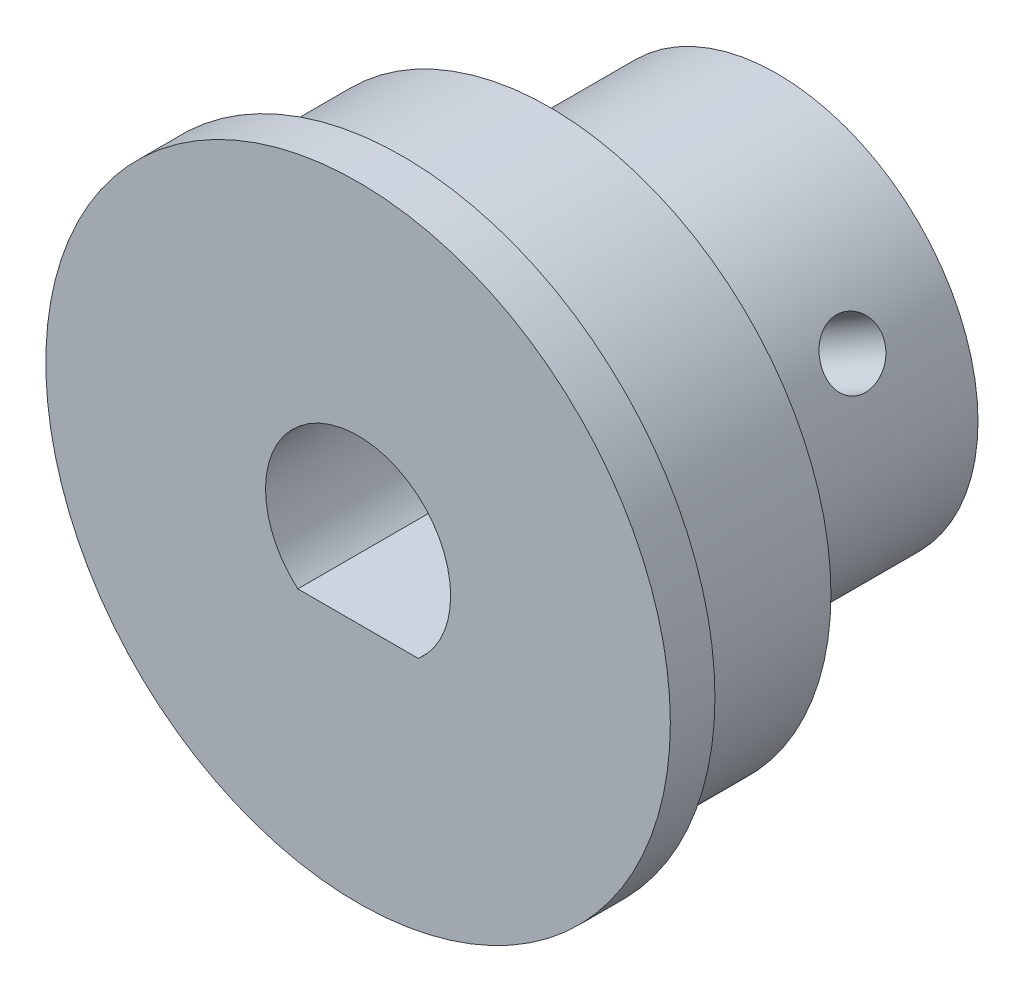
ISO-10303-21;
HEADER;
FILE_DESCRIPTION(('STEP AP214'),'2;1');
FILE_NAME('part.step','',(''),(''),'','','');
FILE_SCHEMA(('AUTOMOTIVE_DESIGN { 1 0 10303 214 1 1 1 1 }'));
ENDSEC;
DATA;
#1=APPLICATION_CONTEXT('core data for automotive mechanical design processes');
#2=APPLICATION_PROTOCOL_DEFINITION('international standard','automotive_design',2000,#1);
#3=PRODUCT_CONTEXT('',#1,'mechanical');
#4=PRODUCT('Part','Part','',(#3));
#5=PRODUCT_RELATED_PRODUCT_CATEGORY('part','',(#4));
#6=PRODUCT_DEFINITION_FORMATION('','',#4);
#7=PRODUCT_DEFINITION_CONTEXT('part definition',#1,'design');
#8=PRODUCT_DEFINITION('design','',#6,#7);
#9=PRODUCT_DEFINITION_SHAPE('','',#8);
#10=(LENGTH_UNIT() NAMED_UNIT(*) SI_UNIT(.MILLI.,.METRE.));
#11=(NAMED_UNIT(*) PLANE_ANGLE_UNIT() SI_UNIT($,.RADIAN.));
#12=(NAMED_UNIT(*) SI_UNIT($,.STERADIAN.) SOLID_ANGLE_UNIT());
#13=UNCERTAINTY_MEASURE_WITH_UNIT(LENGTH_MEASURE(1.E-05),#10,'distance_accuracy_value','');
#14=(GEOMETRIC_REPRESENTATION_CONTEXT(3) GLOBAL_UNCERTAINTY_ASSIGNED_CONTEXT((#13)) GLOBAL_UNIT_ASSIGNED_CONTEXT((#10,
#11,#12)) REPRESENTATION_CONTEXT('',''));
#15=CARTESIAN_POINT('',(0.,0.,0.));
#16=DIRECTION('',(0.,0.,1.));
#17=DIRECTION('',(1.,0.,0.));
#18=AXIS2_PLACEMENT_3D('',#15,#16,#17);
#19=CARTESIAN_POINT('',(0.,0.,8.6));
#20=DIRECTION('',(0.,0.,1.));
#21=DIRECTION('',(1.,0.,0.));
#22=AXIS2_PLACEMENT_3D('',#19,#20,#21);
#23=PLANE('',#22);
#24=CARTESIAN_POINT('',(0.,0.,8.6));
#25=DIRECTION('',(0.,0.,1.));
#26=DIRECTION('',(1.,0.,0.));
#27=AXIS2_PLACEMENT_3D('',#24,#25,#26);
#28=CIRCLE('',#27,14.);
#29=CARTESIAN_POINT('',(14.,0.,8.6));
#30=VERTEX_POINT('',#29);
#31=EDGE_CURVE('E116',#30,#30,#28,.T.);
#32=ORIENTED_EDGE('',*,*,#31,.T.);
#33=EDGE_LOOP('',(#32));
#34=FACE_BOUND('',#33,.T.);
#35=CARTESIAN_POINT('',(0.,0.,8.6));
#36=DIRECTION('',(0.,0.,1.));
#37=DIRECTION('',(1.,0.,0.));
#38=AXIS2_PLACEMENT_3D('',#35,#36,#37);
#39=CIRCLE('',#38,4.15);
#40=CARTESIAN_POINT('',(2.70185121722126,-3.15,8.6));
#41=VERTEX_POINT('',#40);
#42=CARTESIAN_POINT('',(-2.70185121722126,-3.15,8.6));
#43=VERTEX_POINT('',#42);
#44=EDGE_CURVE('E89',#41,#43,#39,.T.);
#45=ORIENTED_EDGE('',*,*,#44,.F.);
#46=DIRECTION('',(-1.,0.,0.));
#47=VECTOR('',#46,1.);
#48=CARTESIAN_POINT('',(0.,-3.15,8.6));
#49=LINE('',#48,#47);
#50=EDGE_CURVE('E61',#41,#43,#49,.T.);
#51=ORIENTED_EDGE('',*,*,#50,.T.);
#52=EDGE_LOOP('',(#45,#51));
#53=FACE_BOUND('',#52,.T.);
#54=ADVANCED_FACE('F33',(#34,#53),#23,.T.);
#55=CARTESIAN_POINT('',(0.193153064458329,0.,-10.));
#56=DIRECTION('',(0.,0.,-1.));
#57=DIRECTION('',(-1.,0.,0.));
#58=AXIS2_PLACEMENT_3D('',#55,#56,#57);
#59=PLANE('',#58);
#60=CARTESIAN_POINT('',(0.193153064458329,0.,-10.));
#61=DIRECTION('',(0.,0.,-1.));
#62=DIRECTION('',(-1.,0.,0.));
#63=AXIS2_PLACEMENT_3D('',#60,#61,#62);
#64=CIRCLE('',#63,9.);
#65=CARTESIAN_POINT('',(-8.80684693554167,0.,-10.));
#66=VERTEX_POINT('',#65);
#67=EDGE_CURVE('E109',#66,#66,#64,.T.);
#68=ORIENTED_EDGE('',*,*,#67,.T.);
#69=EDGE_LOOP('',(#68));
#70=FACE_BOUND('',#69,.T.);
#71=CARTESIAN_POINT('',(0.,0.,-10.));
#72=DIRECTION('',(0.,0.,1.));
#73=DIRECTION('',(1.,0.,0.));
#74=AXIS2_PLACEMENT_3D('',#71,#72,#73);
#75=CIRCLE('',#74,4.15);
#76=CARTESIAN_POINT('',(2.70185121722126,-3.15,-10.));
#77=VERTEX_POINT('',#76);
#78=CARTESIAN_POINT('',(-2.70185121722126,-3.15,-10.));
#79=VERTEX_POINT('',#78);
#80=EDGE_CURVE('E100',#77,#79,#75,.T.);
#81=ORIENTED_EDGE('',*,*,#80,.T.);
#82=DIRECTION('',(-1.,0.,0.));
#83=VECTOR('',#82,1.);
#84=CARTESIAN_POINT('',(0.,-3.15,-10.));
#85=LINE('',#84,#83);
#86=EDGE_CURVE('E95',#77,#79,#85,.T.);
#87=ORIENTED_EDGE('',*,*,#86,.F.);
#88=EDGE_LOOP('',(#81,#87));
#89=FACE_BOUND('',#88,.T.);
#90=ADVANCED_FACE('F142',(#70,#89),#59,.T.);
#91=CARTESIAN_POINT('',(0.,0.,6.6));
#92=DIRECTION('',(0.,0.,-1.));
#93=DIRECTION('',(-1.,0.,0.));
#94=AXIS2_PLACEMENT_3D('',#91,#92,#93);
#95=CYLINDRICAL_SURFACE('',#94,12.6);
#96=CARTESIAN_POINT('',(0.,0.,6.6));
#97=DIRECTION('',(0.,0.,1.));
#98=DIRECTION('',(1.,0.,0.));
#99=AXIS2_PLACEMENT_3D('',#96,#97,#98);
#100=CIRCLE('',#99,12.6);
#101=CARTESIAN_POINT('',(12.6,0.,6.6));
#102=VERTEX_POINT('',#101);
#103=EDGE_CURVE('E115',#102,#102,#100,.T.);
#104=ORIENTED_EDGE('',*,*,#103,.F.);
#105=EDGE_LOOP('',(#104));
#106=FACE_BOUND('',#105,.T.);
#107=CARTESIAN_POINT('',(0.,0.,0.));
#108=DIRECTION('',(0.,0.,1.));
#109=DIRECTION('',(1.,0.,0.));
#110=AXIS2_PLACEMENT_3D('',#107,#108,#109);
#111=CIRCLE('',#110,12.6);
#112=CARTESIAN_POINT('',(12.6,0.,0.));
#113=VERTEX_POINT('',#112);
#114=EDGE_CURVE('E119',#113,#113,#111,.T.);
#115=ORIENTED_EDGE('',*,*,#114,.T.);
#116=EDGE_LOOP('',(#115));
#117=FACE_BOUND('',#116,.T.);
#118=ADVANCED_FACE('F35',(#106,#117),#95,.T.);
#119=CARTESIAN_POINT('',(0.,0.,0.));
#120=DIRECTION('',(0.,0.,1.));
#121=DIRECTION('',(1.,0.,0.));
#122=AXIS2_PLACEMENT_3D('',#119,#120,#121);
#123=PLANE('',#122);
#124=CARTESIAN_POINT('',(0.193153064458329,0.,0.));
#125=DIRECTION('',(0.,0.,-1.));
#126=DIRECTION('',(-1.,0.,0.));
#127=AXIS2_PLACEMENT_3D('',#124,#125,#126);
#128=CIRCLE('',#127,9.);
#129=CARTESIAN_POINT('',(-8.80684693554167,0.,0.));
#130=VERTEX_POINT('',#129);
#131=EDGE_CURVE('E74',#130,#130,#128,.T.);
#132=ORIENTED_EDGE('',*,*,#131,.F.);
#133=EDGE_LOOP('',(#132));
#134=FACE_BOUND('',#133,.T.);
#135=ORIENTED_EDGE('',*,*,#114,.F.);
#136=EDGE_LOOP('',(#135));
#137=FACE_BOUND('',#136,.T.);
#138=ADVANCED_FACE('F149',(#134,#137),#123,.F.);
#139=CARTESIAN_POINT('',(0.,0.,8.6));
#140=DIRECTION('',(0.,0.,-1.));
#141=DIRECTION('',(-1.,0.,0.));
#142=AXIS2_PLACEMENT_3D('',#139,#140,#141);
#143=CYLINDRICAL_SURFACE('',#142,14.);
#144=ORIENTED_EDGE('',*,*,#31,.F.);
#145=EDGE_LOOP('',(#144));
#146=FACE_BOUND('',#145,.T.);
#147=CARTESIAN_POINT('',(0.,0.,6.6));
#148=DIRECTION('',(0.,0.,1.));
#149=DIRECTION('',(1.,0.,0.));
#150=AXIS2_PLACEMENT_3D('',#147,#148,#149);
#151=CIRCLE('',#150,14.);
#152=CARTESIAN_POINT('',(14.,0.,6.6));
#153=VERTEX_POINT('',#152);
#154=EDGE_CURVE('E112',#153,#153,#151,.T.);
#155=ORIENTED_EDGE('',*,*,#154,.T.);
#156=EDGE_LOOP('',(#155));
#157=FACE_BOUND('',#156,.T.);
#158=ADVANCED_FACE('F196',(#146,#157),#143,.T.);
#159=CARTESIAN_POINT('',(0.,0.,6.6));
#160=DIRECTION('',(0.,0.,1.));
#161=DIRECTION('',(1.,0.,0.));
#162=AXIS2_PLACEMENT_3D('',#159,#160,#161);
#163=PLANE('',#162);
#164=ORIENTED_EDGE('',*,*,#103,.T.);
#165=EDGE_LOOP('',(#164));
#166=FACE_BOUND('',#165,.T.);
#167=ORIENTED_EDGE('',*,*,#154,.F.);
#168=EDGE_LOOP('',(#167));
#169=FACE_BOUND('',#168,.T.);
#170=ADVANCED_FACE('F189',(#166,#169),#163,.F.);
#171=CARTESIAN_POINT('',(0.193153064458329,0.,-10.));
#172=DIRECTION('',(0.,0.,1.));
#173=DIRECTION('',(1.,0.,0.));
#174=AXIS2_PLACEMENT_3D('',#171,#172,#173);
#175=CYLINDRICAL_SURFACE('',#174,9.);
#176=CARTESIAN_POINT('',(-6.71407297693941,5.76976848868625,-5.5));
#177=CARTESIAN_POINT('',(-6.71407570241382,5.76976643820043,-5.42479937004048));
#178=CARTESIAN_POINT('',(-6.71818204103032,5.76486032693949,-5.34955499954005));
#179=CARTESIAN_POINT('',(-6.73442199556218,5.74533365397885,-5.20117490103493));
#180=CARTESIAN_POINT('',(-6.74656345932425,5.73070359491148,-5.12804130756126));
#181=CARTESIAN_POINT('',(-6.77828787676516,5.69206743452031,-4.98605685263484));
#182=CARTESIAN_POINT('',(-6.79786437959359,5.66806946056385,-4.91720233862304));
#183=CARTESIAN_POINT('',(-6.84357221791581,5.61122280462049,-4.78561264350414));
#184=CARTESIAN_POINT('',(-6.86970272547886,5.57837524051396,-4.72287669086263));
#185=CARTESIAN_POINT('',(-6.92767214164482,5.5041873454294,-4.60465456654698));
#186=CARTESIAN_POINT('',(-6.95956101503921,5.46277217546627,-4.5492398553692));
#187=CARTESIAN_POINT('',(-7.02758565840639,5.37253375195583,-4.44784634558882));
#188=CARTESIAN_POINT('',(-7.06372173656648,5.32370996074641,-4.40186823239386));
#189=CARTESIAN_POINT('',(-7.13914881096259,5.21934102345788,-4.32030402626701));
#190=CARTESIAN_POINT('',(-7.17846238289371,5.16374603965025,-4.28480250029127));
#191=CARTESIAN_POINT('',(-7.25854219089167,5.04749579534749,-4.22572220603851));
#192=CARTESIAN_POINT('',(-7.29930836071933,4.98684076542421,-4.20214289484558));
#193=CARTESIAN_POINT('',(-7.38060034365181,4.86248260701304,-4.16774830656838));
#194=CARTESIAN_POINT('',(-7.4211258932378,4.7988031688341,-4.15684681532878));
#195=CARTESIAN_POINT('',(-7.50092845965021,4.66978169689071,-4.14787133954996));
#196=CARTESIAN_POINT('',(-7.54020556196711,4.60443977752282,-4.14979647476641));
#197=CARTESIAN_POINT('',(-7.61600053114387,4.47467440648357,-4.16634762043307));
#198=CARTESIAN_POINT('',(-7.65254251121858,4.41024839640291,-4.18084352096416));
#199=CARTESIAN_POINT('',(-7.72242402234965,4.28355882825896,-4.22194135628796));
#200=CARTESIAN_POINT('',(-7.75576352614665,4.22129528860539,-4.24854339411658));
#201=CARTESIAN_POINT('',(-7.81860382140223,4.10077790205113,-4.31311239636955));
#202=CARTESIAN_POINT('',(-7.8481012364031,4.04252760290949,-4.35108926167315));
#203=CARTESIAN_POINT('',(-7.90276886952091,3.931902982938,-4.43732514656782));
#204=CARTESIAN_POINT('',(-7.9279388417112,3.87952899611505,-4.48558475017353));
#205=CARTESIAN_POINT('',(-7.97386934107694,3.78188944332668,-4.59151795651766));
#206=CARTESIAN_POINT('',(-7.99458902200598,3.73669064281558,-4.6492708310444));
#207=CARTESIAN_POINT('',(-8.03117470049944,3.65546487480578,-4.77227877462203));
#208=CARTESIAN_POINT('',(-8.04704062441281,3.61943804648426,-4.83753395749251));
#209=CARTESIAN_POINT('',(-8.07387692762173,3.55771782359596,-4.97390427536972));
#210=CARTESIAN_POINT('',(-8.08483475332455,3.53205094335543,-5.0450338920392));
#211=CARTESIAN_POINT('',(-8.10176485716089,3.4921070391261,-5.19098809641853));
#212=CARTESIAN_POINT('',(-8.10773738928179,3.47782943488581,-5.26581249568335));
#213=CARTESIAN_POINT('',(-8.11466519736122,3.46124793797269,-5.41648456781597));
#214=CARTESIAN_POINT('',(-8.11565451881994,3.45886279664091,-5.49232173792764));
#215=CARTESIAN_POINT('',(-8.11270699826652,3.46593460295485,-5.64334378552298));
#216=CARTESIAN_POINT('',(-8.10877026995471,3.47539127727442,-5.71852867802183));
#217=CARTESIAN_POINT('',(-8.0960007829333,3.50573742654533,-5.86581010292219));
#218=CARTESIAN_POINT('',(-8.0871873155837,3.52658184985431,-5.9379176058598));
#219=CARTESIAN_POINT('',(-8.06469588710246,3.57892964748476,-6.07734587310256));
#220=CARTESIAN_POINT('',(-8.05101772434426,3.6104334636024,-6.14466643886519));
#221=CARTESIAN_POINT('',(-8.01875438282484,3.68322741907835,-6.27303848141497));
#222=CARTESIAN_POINT('',(-8.00014119962749,3.72457326701454,-6.33405132706635));
#223=CARTESIAN_POINT('',(-7.95816267280673,3.81556757428929,-6.44767488355333));
#224=CARTESIAN_POINT('',(-7.93479714318406,3.86521635857799,-6.50028526538602));
#225=CARTESIAN_POINT('',(-7.88339938335785,3.97149811367249,-6.59590191038237));
#226=CARTESIAN_POINT('',(-7.8553422131521,4.02816796636464,-6.63885380571207));
#227=CARTESIAN_POINT('',(-7.79504492899107,4.1464555070708,-6.71354685115284));
#228=CARTESIAN_POINT('',(-7.76280497322823,4.20807300793181,-6.74528842506797));
#229=CARTESIAN_POINT('',(-7.69490671365392,4.33400517119871,-6.79650258580824));
#230=CARTESIAN_POINT('',(-7.65926598722268,4.3983050908718,-6.81603469950309));
#231=CARTESIAN_POINT('',(-7.58525021296572,4.52791433936262,-6.84249810008966));
#232=CARTESIAN_POINT('',(-7.54687532121797,4.59322361039581,-6.84943010565211));
#233=CARTESIAN_POINT('',(-7.46874854953235,4.72238440275397,-6.85049796377113));
#234=CARTESIAN_POINT('',(-7.42901054048841,4.78624348608914,-6.84473827401586));
#235=CARTESIAN_POINT('',(-7.34905007140405,4.91128100991115,-6.82083121983712));
#236=CARTESIAN_POINT('',(-7.30882760464473,4.97245941316517,-6.80268368341286));
#237=CARTESIAN_POINT('',(-7.22911975684115,5.0906741841653,-6.75449912379762));
#238=CARTESIAN_POINT('',(-7.1896362064918,5.1477010737265,-6.7244358452744));
#239=CARTESIAN_POINT('',(-7.11287368426254,5.2560811203969,-6.65329038498781));
#240=CARTESIAN_POINT('',(-7.07559481186651,5.30743402156375,-6.61220770644742));
#241=CARTESIAN_POINT('',(-7.00422599964837,5.40382976460162,-6.51965198407869));
#242=CARTESIAN_POINT('',(-6.97017566616031,5.44879694995553,-6.46806957622605));
#243=CARTESIAN_POINT('',(-6.90708785427668,5.53075590349029,-6.35620738326882));
#244=CARTESIAN_POINT('',(-6.8780515389651,5.56774582170677,-6.29592558613492));
#245=CARTESIAN_POINT('',(-6.82612074651695,5.63307638629953,-6.16804903107758));
#246=CARTESIAN_POINT('',(-6.80325384004222,5.66137828159677,-6.10042327968924));
#247=CARTESIAN_POINT('',(-6.76489458652679,5.70845892434937,-5.9600199943986));
#248=CARTESIAN_POINT('',(-6.74939436780951,5.72724783831319,-5.88724805544607));
#249=CARTESIAN_POINT('',(-6.73004240655255,5.75060959203054,-5.76178089391321));
#250=CARTESIAN_POINT('',(-6.72406777429479,5.75778560529872,-5.70987301062038));
#251=CARTESIAN_POINT('',(-6.71608213820538,5.76736573177228,-5.60531722875668));
#252=CARTESIAN_POINT('',(-6.71407106805985,5.76976992481439,-5.55266934258155));
#253=CARTESIAN_POINT('',(-6.71407297693941,5.76976848868625,-5.5));
#254=B_SPLINE_CURVE_WITH_KNOTS('',3,(#176,#177,#178,#179,#180,#181,#182,#183,#184,#185,#186,
#187,#188,#189,#190,#191,#192,#193,#194,#195,#196,#197,#198,#199,#200,#201,#202,#203,#204,#205,
#206,#207,#208,#209,#210,#211,#212,#213,#214,#215,#216,#217,#218,#219,#220,#221,#222,#223,#224,
#225,#226,#227,#228,#229,#230,#231,#232,#233,#234,#235,#236,#237,#238,#239,#240,#241,#242,#243,
#244,#245,#246,#247,#248,#249,#250,#251,#252,#253),.UNSPECIFIED.,.T.,.F.,(4,2,2,2,2,2,2,2,2,2,2,
2,2,2,2,2,2,2,2,2,2,2,2,2,2,2,2,2,2,2,2,2,2,2,2,2,2,2,4),(0.,0.225408914531807,
0.451038309820972,0.676472388224373,0.901878003132472,1.12934265922539,1.35682383089733,
1.58609392898298,1.81535358558581,2.04304489728038,2.27072058351643,2.49606753179796,
2.72141639805382,2.94696198535868,3.17252038608444,3.40006806824574,3.62761920305114,
3.85574907448142,4.08386732259548,4.31042492313896,4.53697729450321,4.76263981357883,
4.98831168675705,5.21529264104505,5.44228248071494,5.67051973277035,5.89874835543597,
6.12585539501303,6.35294948070856,6.57818147831605,6.80341660325206,7.02915079860248,
7.25489517222135,7.48312370985854,7.71140511794868,7.94069040866216,8.16973014256968,
8.32760565482416,8.48547852566053),.UNSPECIFIED.);
#255=CARTESIAN_POINT('',(-6.71407297693941,5.76976848868625,-5.5));
#256=VERTEX_POINT('',#255);
#257=EDGE_CURVE('E79',#256,#256,#254,.T.);
#258=ORIENTED_EDGE('',*,*,#257,.T.);
#259=EDGE_LOOP('',(#258));
#260=FACE_BOUND('',#259,.T.);
#261=CARTESIAN_POINT('',(8.64353217031446,3.09694897718871,-5.5));
#262=CARTESIAN_POINT('',(8.64353175727885,3.0969523627617,-5.42479937004048));
#263=CARTESIAN_POINT('',(8.64133610960133,3.10296161195058,-5.34955499954005));
#264=CARTESIAN_POINT('',(8.63254549203196,3.12678916161181,-5.20117490103493));
#265=CARTESIAN_POINT('',(8.62594622110178,3.14461900720257,-5.12804130756126));
#266=CARTESIAN_POINT('',(8.60834853341879,3.19141123882224,-4.98605685263484));
#267=CARTESIAN_POINT('',(8.59735392974736,3.22036397456716,-4.91720233862303));
#268=CARTESIAN_POINT('',(8.57097720074133,3.28837145167795,-4.78561264350414));
#269=CARTESIAN_POINT('',(8.55559562955415,3.32742491709459,-4.72287669086263));
#270=CARTESIAN_POINT('',(8.52033173584061,3.41472185167916,-4.60465456654698));
#271=CARTESIAN_POINT('',(8.50040958324768,3.46304601111832,-4.5492398553692));
#272=CARTESIAN_POINT('',(8.45627313777378,3.5670762921129,-4.44784634558882));
#273=CARTESIAN_POINT('',(8.4320585333574,3.62278294939739,-4.40186823239385));
#274=CARTESIAN_POINT('',(8.3793859194976,3.74028918060182,-4.32030402626701));
#275=CARTESIAN_POINT('',(8.35089603716277,3.8021332245115,-4.28480250029127));
#276=CARTESIAN_POINT('',(8.29026027639942,3.92960949471929,-4.22572220603851));
#277=CARTESIAN_POINT('',(8.25811456453238,3.99524154836667,-4.20214289484558));
#278=CARTESIAN_POINT('',(8.19106323164669,4.1278215499158,-4.16774830656838));
#279=CARTESIAN_POINT('',(8.15617799527801,4.19475742444906,-4.15684681532878));
#280=CARTESIAN_POINT('',(8.08434340614758,4.32837921022109,-4.14787133954996));
#281=CARTESIAN_POINT('',(8.0473941952014,4.39506513829853,-4.14979647476641));
#282=CARTESIAN_POINT('',(7.97291157193827,4.52558819260428,-4.16634762043307));
#283=CARTESIAN_POINT('',(7.93538800058131,4.58944748069389,-4.18084352096416));
#284=CARTESIAN_POINT('',(7.8606123717397,4.71331142866022,-4.22194135628796));
#285=CARTESIAN_POINT('',(7.82336031656868,4.77331605572477,-4.24854339411658));
#286=CARTESIAN_POINT('',(7.75040934584276,4.88799604107455,-4.31311239636955));
#287=CARTESIAN_POINT('',(7.7147118145085,4.9426667013821,-4.35108926167315));
#288=CARTESIAN_POINT('',(7.64624189988809,5.04532257041263,-4.43732514656782));
#289=CARTESIAN_POINT('',(7.61346968289709,5.09330739915345,-4.48558475017353));
#290=CARTESIAN_POINT('',(7.55187659945108,5.18190415480687,-4.59151795651766));
#291=CARTESIAN_POINT('',(7.5230931304524,5.22244732510527,-4.6492708310444));
#292=CARTESIAN_POINT('',(7.47104239116075,5.2947443361002,-4.77227877462203));
#293=CARTESIAN_POINT('',(7.44777520457321,5.32649804342445,-4.83753395749251));
#294=CARTESIAN_POINT('',(7.40774207522916,5.38059907519119,-4.97390427536972));
#295=CARTESIAN_POINT('',(7.39099281775639,5.40292227074034,-5.0450338920392));
#296=CARTESIAN_POINT('',(7.36486543388563,5.43755612286598,-5.19098809641853));
#297=CARTESIAN_POINT('',(7.3554869319688,5.44986728952774,-5.26581249568335));
#298=CARTESIAN_POINT('',(7.34459083844898,5.46415769577363,-5.41648456781597));
#299=CARTESIAN_POINT('',(7.3430199061934,5.46620704395528,-5.49232173792764));
#300=CARTESIAN_POINT('',(7.34767050983521,5.46011851312087,-5.64334378552298));
#301=CARTESIAN_POINT('',(7.35389186587537,5.45198086923527,-5.71852867802183));
#302=CARTESIAN_POINT('',(7.37378765854031,5.42574909444597,-5.86581010292219));
#303=CARTESIAN_POINT('',(7.38743272497832,5.4076941961713,-5.9379176058598));
#304=CARTESIAN_POINT('',(7.42152153331783,5.36204214892392,-6.07734587310256));
#305=CARTESIAN_POINT('',(7.44196555701277,5.33444460443941,-6.14466643886519));
#306=CARTESIAN_POINT('',(7.48887530093717,5.27010675333464,-6.27303848141497));
#307=CARTESIAN_POINT('',(7.51537526399225,5.23331433987235,-6.33405132706635));
#308=CARTESIAN_POINT('',(7.57318938228157,5.15146271559474,-6.44767488355334));
#309=CARTESIAN_POINT('',(7.60450372593127,5.10640318122429,-6.50028526538602));
#310=CARTESIAN_POINT('',(7.6708475458888,5.00875053796993,-6.59590191038237));
#311=CARTESIAN_POINT('',(7.70589649284605,4.95611738946736,-6.63885380571207));
#312=CARTESIAN_POINT('',(7.77818786596825,4.84475463925162,-6.71354685115284));
#313=CARTESIAN_POINT('',(7.81543020915017,4.78602526811361,-6.74528842506797));
#314=CARTESIAN_POINT('',(7.89054153190568,4.66425756881605,-6.79650258580824));
#315=CARTESIAN_POINT('',(7.92840653258826,4.60124183448073,-6.81603469950309));
#316=CARTESIAN_POINT('',(8.00364354721823,4.47233766944801,-6.84249810008966));
#317=CARTESIAN_POINT('',(8.04101558916174,4.40644940281039,-6.84943010565211));
#318=CARTESIAN_POINT('',(8.11380873067403,4.2742092376359,-6.85049796377113));
#319=CARTESIAN_POINT('',(8.1492433145827,4.20786557064044,-6.84473827401586));
#320=CARTESIAN_POINT('',(8.21754875209668,4.07609901120386,-6.82083121983712));
#321=CARTESIAN_POINT('',(8.25041957009798,4.01067613156041,-6.80268368341286));
#322=CARTESIAN_POINT('',(8.31294264098485,3.88253972498146,-6.75449912379762));
#323=CARTESIAN_POINT('',(8.34258760086898,3.81983252256672,-6.7244358452744));
#324=CARTESIAN_POINT('',(8.39806621343427,3.69916420492241,-6.6532903849878));
#325=CARTESIAN_POINT('',(8.42389969420478,3.64120330381959,-6.61220770644742));
#326=CARTESIAN_POINT('',(8.47169645038318,3.53119822788182,-6.51965198407869));
#327=CARTESIAN_POINT('',(8.49361400849232,3.47922618139687,-6.46806957622605));
#328=CARTESIAN_POINT('',(8.53304863837919,3.3836110568691,-6.35620738326882));
#329=CARTESIAN_POINT('',(8.55056468958278,3.33996991106874,-6.29592558613492));
#330=CARTESIAN_POINT('',(8.58117722193962,3.26233124327359,-6.16804903107758));
#331=CARTESIAN_POINT('',(8.59425392900491,3.2283769737119,-6.10042327968924));
#332=CARTESIAN_POINT('',(8.61584733489744,3.17161656432103,-5.9600199943986));
#333=CARTESIAN_POINT('',(8.624368902341,3.14879852416574,-5.88724805544607));
#334=CARTESIAN_POINT('',(8.6349247939087,3.12035835724548,-5.76178089391321));
#335=CARTESIAN_POINT('',(8.63815208756796,3.1115961672979,-5.70987301062038));
#336=CARTESIAN_POINT('',(8.64245590242082,3.09989034034232,-5.60531722875668));
#337=CARTESIAN_POINT('',(8.64353245959813,3.09694660598645,-5.55266934258155));
#338=CARTESIAN_POINT('',(8.64353217031446,3.09694897718871,-5.5));
#339=B_SPLINE_CURVE_WITH_KNOTS('',3,(#261,#262,#263,#264,#265,#266,#267,#268,#269,#270,#271,
#272,#273,#274,#275,#276,#277,#278,#279,#280,#281,#282,#283,#284,#285,#286,#287,#288,#289,#290,
#291,#292,#293,#294,#295,#296,#297,#298,#299,#300,#301,#302,#303,#304,#305,#306,#307,#308,#309,
#310,#311,#312,#313,#314,#315,#316,#317,#318,#319,#320,#321,#322,#323,#324,#325,#326,#327,#328,
#329,#330,#331,#332,#333,#334,#335,#336,#337,#338),.UNSPECIFIED.,.T.,.F.,(4,2,2,2,2,2,2,2,2,2,2,
2,2,2,2,2,2,2,2,2,2,2,2,2,2,2,2,2,2,2,2,2,2,2,2,2,2,2,4),(0.,0.225408914531807,
0.451038309820972,0.676472388224375,0.901878003132474,1.12934265922539,1.35682383089733,
1.58609392898298,1.81535358558581,2.04304489728038,2.27072058351643,2.49606753179796,
2.72141639805382,2.94696198535868,3.17252038608444,3.40006806824574,3.62761920305114,
3.85574907448142,4.08386732259548,4.31042492313896,4.5369772945032,4.76263981357883,
4.98831168675704,5.21529264104505,5.44228248071494,5.67051973277035,5.89874835543597,
6.12585539501303,6.35294948070856,6.57818147831605,6.80341660325206,7.02915079860248,
7.25489517222135,7.48312370985854,7.71140511794868,7.94069040866216,8.16973014256968,
8.32760565482416,8.48547852566053),.UNSPECIFIED.);
#340=CARTESIAN_POINT('',(8.64353217031446,3.09694897718871,-5.5));
#341=VERTEX_POINT('',#340);
#342=EDGE_CURVE('E37',#341,#341,#339,.T.);
#343=ORIENTED_EDGE('',*,*,#342,.T.);
#344=EDGE_LOOP('',(#343));
#345=FACE_BOUND('',#344,.T.);
#346=CARTESIAN_POINT('',(0.,-8.99792708870717,-4.15));
#347=CARTESIAN_POINT('',(0.0752394546961814,-8.99954102412785,-4.15000306098525));
#348=CARTESIAN_POINT('',(0.150542090655318,-9.00020469254086,-4.15631105130649));
#349=CARTESIAN_POINT('',(0.29908460383019,-8.99968393302325,-4.18138997029337));
#350=CARTESIAN_POINT('',(0.372322482034525,-8.99849777276559,-4.20017257171986));
#351=CARTESIAN_POINT('',(0.514562567454904,-8.99454034603302,-4.24964411845224));
#352=CARTESIAN_POINT('',(0.583567541535402,-8.99177012748086,-4.2803251880957));
#353=CARTESIAN_POINT('',(0.715454001845212,-8.98507471722795,-4.35270564658201));
#354=CARTESIAN_POINT('',(0.778336322690785,-8.98114968324133,-4.39440353076975));
#355=CARTESIAN_POINT('',(0.896605035367516,-8.97266382326765,-4.48791575014261));
#356=CARTESIAN_POINT('',(0.951946595523385,-8.96809949634107,-4.53978646691452));
#357=CARTESIAN_POINT('',(1.05318319122935,-8.95895854368459,-4.6520502278683));
#358=CARTESIAN_POINT('',(1.09907766752354,-8.95438191724281,-4.71244377623495));
#359=CARTESIAN_POINT('',(1.18037705840124,-8.9457853590557,-4.84046039361883));
#360=CARTESIAN_POINT('',(1.2157190147511,-8.94176884190813,-4.90812370251793));
#361=CARTESIAN_POINT('',(1.27452737859019,-8.9348481582644,-5.04848140555974));
#362=CARTESIAN_POINT('',(1.29799421246249,-8.93194395183099,-5.12117561895839));
#363=CARTESIAN_POINT('',(1.33227705935879,-8.92763668195237,-5.26917434691202));
#364=CARTESIAN_POINT('',(1.34315162260277,-8.92622667356147,-5.34446509056428));
#365=CARTESIAN_POINT('',(1.35212007685888,-8.92506678117755,-5.49581494787205));
#366=CARTESIAN_POINT('',(1.35021453153299,-8.92531682396858,-5.57187402749266));
#367=CARTESIAN_POINT('',(1.33373519394262,-8.92743741547518,-5.72208872401411));
#368=CARTESIAN_POINT('',(1.31924241626508,-8.92929760065188,-5.79625339741235));
#369=CARTESIAN_POINT('',(1.27812632247596,-8.93438628997588,-5.94109023688005));
#370=CARTESIAN_POINT('',(1.25150270338727,-8.93761482829872,-6.01176231567041));
#371=CARTESIAN_POINT('',(1.1867933716307,-8.94503981910043,-6.14785499371493));
#372=CARTESIAN_POINT('',(1.14867309098975,-8.94923918162131,-6.21325899080538));
#373=CARTESIAN_POINT('',(1.06207240742132,-8.95806159182588,-6.33677466731667));
#374=CARTESIAN_POINT('',(1.0135914849523,-8.96268466074999,-6.39488598080884));
#375=CARTESIAN_POINT('',(0.907223001226896,-8.97178728999115,-6.502604994437));
#376=CARTESIAN_POINT('',(0.849269986211105,-8.97626557161132,-6.55214819941458));
#377=CARTESIAN_POINT('',(0.725824386660134,-8.98443548691155,-6.64081274792487));
#378=CARTESIAN_POINT('',(0.660331882057378,-8.98812712893026,-6.67993420193269));
#379=CARTESIAN_POINT('',(0.523743406273686,-8.99418541403277,-6.74657887733334));
#380=CARTESIAN_POINT('',(0.452655372067144,-8.99655389664476,-6.77411818761125));
#381=CARTESIAN_POINT('',(0.30682953586758,-8.99957728759559,-6.81686283793139));
#382=CARTESIAN_POINT('',(0.232091970136746,-9.00023230671066,-6.83206897527524));
#383=CARTESIAN_POINT('',(0.0817999962495273,-8.99962204392097,-6.84962307950598));
#384=CARTESIAN_POINT('',(0.00625861375853569,-8.99837365446243,-6.85208331439681));
#385=CARTESIAN_POINT('',(-0.144122310366849,-8.99399267112197,-6.8443946849871));
#386=CARTESIAN_POINT('',(-0.218961862293036,-8.99086010491403,-6.83424600587858));
#387=CARTESIAN_POINT('',(-0.365671378645748,-8.98293406182364,-6.80169860559158));
#388=CARTESIAN_POINT('',(-0.43754708300971,-8.97814398210921,-6.77932488643082));
#389=CARTESIAN_POINT('',(-0.576512235231331,-8.96730047089877,-6.72301076235873));
#390=CARTESIAN_POINT('',(-0.64360138592453,-8.96124696105643,-6.68906964006062));
#391=CARTESIAN_POINT('',(-0.771793714113579,-8.94835585866841,-6.61020355528023));
#392=CARTESIAN_POINT('',(-0.832833229185512,-8.94151129552158,-6.56517625585468));
#393=CARTESIAN_POINT('',(-0.946525610399025,-8.92773309944921,-6.46555812364156));
#394=CARTESIAN_POINT('',(-0.999177965411254,-8.92079946112307,-6.41096670842411));
#395=CARTESIAN_POINT('',(-1.09503167087897,-8.90746578797024,-6.29322998214618));
#396=CARTESIAN_POINT('',(-1.13815339495716,-8.90107050635141,-6.23001925019766));
#397=CARTESIAN_POINT('',(-1.21315370726497,-8.88953020869941,-6.09714121904077));
#398=CARTESIAN_POINT('',(-1.24503279571034,-8.88438513704413,-6.02747420726423));
#399=CARTESIAN_POINT('',(-1.29642450009867,-8.87591332036382,-5.88411509438238));
#400=CARTESIAN_POINT('',(-1.31601469791808,-8.87257518656758,-5.81045150145912));
#401=CARTESIAN_POINT('',(-1.34253851073248,-8.86802321452307,-5.66081788750993));
#402=CARTESIAN_POINT('',(-1.34947325477066,-8.86680918677526,-5.58484807284602));
#403=CARTESIAN_POINT('',(-1.35046245799701,-8.86663693395771,-5.43380927394301));
#404=CARTESIAN_POINT('',(-1.34468242447695,-8.86764972250556,-5.35874135341487));
#405=CARTESIAN_POINT('',(-1.32076076585866,-8.8717647577948,-5.21066301365792));
#406=CARTESIAN_POINT('',(-1.30261919662465,-8.87486699509357,-5.13765258513244));
#407=CARTESIAN_POINT('',(-1.25454856608769,-8.88283447381212,-4.99580656925284));
#408=CARTESIAN_POINT('',(-1.22463071623375,-8.88769803803327,-4.92696708272981));
#409=CARTESIAN_POINT('',(-1.15387742295853,-8.89869569622202,-4.79526179853338));
#410=CARTESIAN_POINT('',(-1.1130414705576,-8.90482984941889,-4.73239627953938));
#411=CARTESIAN_POINT('',(-1.02102533246599,-8.91784448577744,-4.61359050395951));
#412=CARTESIAN_POINT('',(-0.969724367500769,-8.92473320311665,-4.55774468810493));
#413=CARTESIAN_POINT('',(-0.858498712768435,-8.93852127019943,-4.4553984048831));
#414=CARTESIAN_POINT('',(-0.79857186266732,-8.94542062217691,-4.40890028563856));
#415=CARTESIAN_POINT('',(-0.67119449130596,-8.95862906433093,-4.32619633654382));
#416=CARTESIAN_POINT('',(-0.60368377939002,-8.96493257679195,-4.29008232149904));
#417=CARTESIAN_POINT('',(-0.463490330989674,-8.97628798469595,-4.22976860305099));
#418=CARTESIAN_POINT('',(-0.390812966874059,-8.98134115645062,-4.2055567251638));
#419=CARTESIAN_POINT('',(-0.264856156720207,-8.98848861338679,-4.17516357200092));
#420=CARTESIAN_POINT('',(-0.212359355561165,-8.99101556463058,-4.16574356629239));
#421=CARTESIAN_POINT('',(-0.106585601143832,-8.99516304302045,-4.15316074078729));
#422=CARTESIAN_POINT('',(-0.0533086590879538,-8.99678358316904,-4.1499978312307));
#423=CARTESIAN_POINT('',(0.,-8.99792708870717,-4.15));
#424=B_SPLINE_CURVE_WITH_KNOTS('',3,(#346,#347,#348,#349,#350,#351,#352,#353,#354,#355,#356,
#357,#358,#359,#360,#361,#362,#363,#364,#365,#366,#367,#368,#369,#370,#371,#372,#373,#374,#375,
#376,#377,#378,#379,#380,#381,#382,#383,#384,#385,#386,#387,#388,#389,#390,#391,#392,#393,#394,
#395,#396,#397,#398,#399,#400,#401,#402,#403,#404,#405,#406,#407,#408,#409,#410,#411,#412,#413,
#414,#415,#416,#417,#418,#419,#420,#421,#422,#423),.UNSPECIFIED.,.T.,.F.,(4,2,2,2,2,2,2,2,2,2,2,
2,2,2,2,2,2,2,2,2,2,2,2,2,2,2,2,2,2,2,2,2,2,2,2,2,2,2,4),(0.,0.225576137410379,
0.451363649188239,0.67700196533137,0.902609480148239,1.12950465627936,1.35641326046918,
1.58464976716116,1.81287807830929,2.04004088135406,2.26719366553288,2.4928951817735,
2.7186023353925,2.94499502463966,3.17139906916915,3.39943944278501,3.62747739897707,
3.85519753037714,4.08290293919892,4.308599229175,4.53429220430091,4.75952532217297,
4.98477241108672,5.21218231005885,5.43960606252139,5.66886353036597,5.89811079662885,
6.12589582184198,6.3536605244567,6.57847799514024,6.803294449836,7.02789738673411,
7.2525107959888,7.47988029600128,7.70730683960695,7.93668642422305,8.16583088979035,
8.32565838939939,8.48548359621602),.UNSPECIFIED.);
#425=CARTESIAN_POINT('',(0.,-8.99792708870717,-4.15));
#426=VERTEX_POINT('',#425);
#427=EDGE_CURVE('E108',#426,#426,#424,.T.);
#428=ORIENTED_EDGE('',*,*,#427,.T.);
#429=EDGE_LOOP('',(#428));
#430=FACE_BOUND('',#429,.T.);
#431=ORIENTED_EDGE('',*,*,#67,.F.);
#432=EDGE_LOOP('',(#431));
#433=FACE_BOUND('',#432,.T.);
#434=ORIENTED_EDGE('',*,*,#131,.T.);
#435=EDGE_LOOP('',(#434));
#436=FACE_BOUND('',#435,.T.);
#437=ADVANCED_FACE('F131',(#260,#345,#430,#433,#436),#175,.T.);
#438=CARTESIAN_POINT('',(0.,-12.,-5.5));
#439=DIRECTION('',(0.,1.,0.));
#440=DIRECTION('',(0.,0.,1.));
#441=AXIS2_PLACEMENT_3D('',#438,#439,#440);
#442=CYLINDRICAL_SURFACE('',#441,1.35);
#443=CARTESIAN_POINT('',(0.,-4.,-5.5));
#444=DIRECTION('',(0.,1.,0.));
#445=DIRECTION('',(0.,0.,1.));
#446=AXIS2_PLACEMENT_3D('',#443,#444,#445);
#447=CIRCLE('',#446,1.35);
#448=CARTESIAN_POINT('',(0.,-4.,-4.15));
#449=VERTEX_POINT('',#448);
#450=EDGE_CURVE('E104',#449,#449,#447,.T.);
#451=ORIENTED_EDGE('',*,*,#450,.T.);
#452=EDGE_LOOP('',(#451));
#453=FACE_BOUND('',#452,.T.);
#454=ORIENTED_EDGE('',*,*,#427,.F.);
#455=EDGE_LOOP('',(#454));
#456=FACE_BOUND('',#455,.T.);
#457=ADVANCED_FACE('F135',(#453,#456),#442,.F.);
#458=CARTESIAN_POINT('',(0.,-4.,-5.5));
#459=DIRECTION('',(0.,1.,0.));
#460=DIRECTION('',(0.,0.,1.));
#461=AXIS2_PLACEMENT_3D('',#458,#459,#460);
#462=PLANE('',#461);
#463=ORIENTED_EDGE('',*,*,#450,.F.);
#464=EDGE_LOOP('',(#463));
#465=FACE_BOUND('',#464,.T.);
#466=ADVANCED_FACE('F139',(#465),#462,.F.);
#467=CARTESIAN_POINT('',(0.,-3.15,-10.));
#468=DIRECTION('',(0.,1.,0.));
#469=DIRECTION('',(0.,0.,1.));
#470=AXIS2_PLACEMENT_3D('',#467,#468,#469);
#471=PLANE('',#470);
#472=ORIENTED_EDGE('',*,*,#50,.F.);
#473=DIRECTION('',(0.,0.,1.));
#474=VECTOR('',#473,1.);
#475=CARTESIAN_POINT('',(2.70185121722126,-3.15,-10.));
#476=LINE('',#475,#474);
#477=EDGE_CURVE('E93',#77,#41,#476,.T.);
#478=ORIENTED_EDGE('',*,*,#477,.F.);
#479=ORIENTED_EDGE('',*,*,#86,.T.);
#480=DIRECTION('',(0.,0.,1.));
#481=VECTOR('',#480,1.);
#482=CARTESIAN_POINT('',(-2.70185121722126,-3.15,-10.));
#483=LINE('',#482,#481);
#484=EDGE_CURVE('E91',#79,#43,#483,.T.);
#485=ORIENTED_EDGE('',*,*,#484,.T.);
#486=EDGE_LOOP('',(#472,#478,#479,#485));
#487=FACE_BOUND('',#486,.T.);
#488=ADVANCED_FACE('F85',(#487),#471,.T.);
#489=CARTESIAN_POINT('',(0.,0.,-10.));
#490=DIRECTION('',(0.,0.,1.));
#491=DIRECTION('',(1.,0.,0.));
#492=AXIS2_PLACEMENT_3D('',#489,#490,#491);
#493=CYLINDRICAL_SURFACE('',#492,4.15);
#494=DIRECTION('',(0.,0.,1.));
#495=VECTOR('',#494,1.);
#496=CARTESIAN_POINT('',(-2.52351032399236,3.29460098414117,-10.));
#497=LINE('',#496,#495);
#498=CARTESIAN_POINT('',(-2.52351032399236,3.29460098414117,-5.14220645792633));
#499=VERTEX_POINT('',#498);
#500=CARTESIAN_POINT('',(-2.52351032399236,3.29460098414117,-5.85779354207367));
#501=VERTEX_POINT('',#500);
#502=EDGE_CURVE('E47',#499,#501,#497,.F.);
#503=ORIENTED_EDGE('',*,*,#502,.T.);
#504=CARTESIAN_POINT('',(-2.52351032399236,3.29460098414117,-5.85779354207367));
#505=CARTESIAN_POINT('',(-2.53218528456227,3.28795328339889,-5.89452109189084));
#506=CARTESIAN_POINT('',(-2.54214133902282,3.28027624873218,-5.93073423241076));
#507=CARTESIAN_POINT('',(-2.56442039417227,3.26289020665096,-6.00190473303239));
#508=CARTESIAN_POINT('',(-2.57674226950081,3.25318216513839,-6.03686268084992));
#509=CARTESIAN_POINT('',(-2.61688875075123,3.22111216448444,-6.13933660654068));
#510=CARTESIAN_POINT('',(-2.64795472390127,3.19575959131992,-6.20470065638648));
#511=CARTESIAN_POINT('',(-2.71679028964952,3.13744741306548,-6.3278709728991));
#512=CARTESIAN_POINT('',(-2.7545505379089,3.10449839261173,-6.38568758196729));
#513=CARTESIAN_POINT('',(-2.83495594095395,3.03125073258172,-6.49269770577338));
#514=CARTESIAN_POINT('',(-2.87760444766944,2.99094703848003,-6.54188524427065));
#515=CARTESIAN_POINT('',(-2.96766272143347,2.901663362384,-6.63219467983763));
#516=CARTESIAN_POINT('',(-3.01519434928791,2.85240222814312,-6.67291835296855));
#517=CARTESIAN_POINT('',(-3.11143036353016,2.74710396720139,-6.74250165950494));
#518=CARTESIAN_POINT('',(-3.16013448380689,2.69106836664835,-6.77136395861225));
#519=CARTESIAN_POINT('',(-3.25572387822113,2.57455258538719,-6.8156853785375));
#520=CARTESIAN_POINT('',(-3.30262600574054,2.51418566671899,-6.83140459052871));
#521=CARTESIAN_POINT('',(-3.39383718456955,2.3896272118184,-6.84966840066142));
#522=CARTESIAN_POINT('',(-3.4381472168666,2.32543714127664,-6.85221801519344));
#523=CARTESIAN_POINT('',(-3.52040913720177,2.1987766076409,-6.84411907383545));
#524=CARTESIAN_POINT('',(-3.55857473644582,2.13639908492284,-6.8341723543788));
#525=CARTESIAN_POINT('',(-3.63035015081896,2.01201735583514,-6.80251206172126));
#526=CARTESIAN_POINT('',(-3.66396021856977,1.95001312894718,-6.78079914133538));
#527=CARTESIAN_POINT('',(-3.72572816841245,1.82920718062918,-6.72662856194559));
#528=CARTESIAN_POINT('',(-3.75395096005903,1.77037440584968,-6.69431354116135));
#529=CARTESIAN_POINT('',(-3.80538670175633,1.6569297997113,-6.61980215945828));
#530=CARTESIAN_POINT('',(-3.82859877449178,1.60231870858999,-6.5776040708281));
#531=CARTESIAN_POINT('',(-3.87088555918331,1.49734977123461,-6.48289217674589));
#532=CARTESIAN_POINT('',(-3.8897973553986,1.44719328575579,-6.43008244149721));
#533=CARTESIAN_POINT('',(-3.9228642842234,1.35500551295103,-6.31647377043467));
#534=CARTESIAN_POINT('',(-3.93701855951966,1.3129756906424,-6.25567339743736));
#535=CARTESIAN_POINT('',(-3.96133922090528,1.2376998308272,-6.12601022255418));
#536=CARTESIAN_POINT('',(-3.97139710510912,1.20469955975741,-6.05698390485883));
#537=CARTESIAN_POINT('',(-3.98747564668778,1.15036827991734,-5.91404170366749));
#538=CARTESIAN_POINT('',(-3.99349704384434,1.12903513300262,-5.8401267188651));
#539=CARTESIAN_POINT('',(-4.00176717768856,1.09936115265825,-5.69100791091131));
#540=CARTESIAN_POINT('',(-4.00408629952606,1.09077814741387,-5.61585627954245));
#541=CARTESIAN_POINT('',(-4.00531340386881,1.08626489093916,-5.46515231154199));
#542=CARTESIAN_POINT('',(-4.00422189101392,1.09033276787519,-5.38960003584129));
#543=CARTESIAN_POINT('',(-3.99863137253477,1.110653361231,-5.2421920442759));
#544=CARTESIAN_POINT('',(-3.99421677937706,1.12660412793128,-5.17029111385633));
#545=CARTESIAN_POINT('',(-3.98183769991016,1.16960033845402,-5.03021075996323));
#546=CARTESIAN_POINT('',(-3.97387278443407,1.196647123544,-4.96203178752284));
#547=CARTESIAN_POINT('',(-3.95385800702219,1.26121467632121,-4.83009183151168));
#548=CARTESIAN_POINT('',(-3.94174426366346,1.298897511728,-4.76641995853051));
#549=CARTESIAN_POINT('',(-3.91300085462209,1.38307547952779,-4.64632469744533));
#550=CARTESIAN_POINT('',(-3.89637032479546,1.42957229768244,-4.58990269942116));
#551=CARTESIAN_POINT('',(-3.85762593732248,1.53109380914079,-4.48431045394279));
#552=CARTESIAN_POINT('',(-3.83537426923324,1.58631732732442,-4.43538138329483));
#553=CARTESIAN_POINT('',(-3.7853104602801,1.70232437653035,-4.34809122390796));
#554=CARTESIAN_POINT('',(-3.75749891264708,1.76310731399586,-4.30972900873878));
#555=CARTESIAN_POINT('',(-3.69669254045604,1.88723934940814,-4.24519919943991));
#556=CARTESIAN_POINT('',(-3.66377124126052,1.95054379972507,-4.21887682899674));
#557=CARTESIAN_POINT('',(-3.59287843324048,2.07823213195875,-4.17855106233513));
#558=CARTESIAN_POINT('',(-3.5549083494068,2.14261570483454,-4.16454419859538));
#559=CARTESIAN_POINT('',(-3.47626323435148,2.26789829210029,-4.14953934565585));
#560=CARTESIAN_POINT('',(-3.43574046169466,2.32883804884323,-4.14807878143142));
#561=CARTESIAN_POINT('',(-3.35194657438793,2.44790819732131,-4.15687502225121));
#562=CARTESIAN_POINT('',(-3.30867544862229,2.50603857769224,-4.16713187468942));
#563=CARTESIAN_POINT('',(-3.22081324195457,2.61800059431858,-4.1988707374632));
#564=CARTESIAN_POINT('',(-3.17622297157384,2.67183479805008,-4.22034598467955));
#565=CARTESIAN_POINT('',(-3.08722529884081,2.77419272360178,-4.27375236191532));
#566=CARTESIAN_POINT('',(-3.04281792658991,2.82271560244941,-4.30568514847369));
#567=CARTESIAN_POINT('',(-2.95369528654259,2.91591127476318,-4.38084937968032));
#568=CARTESIAN_POINT('',(-2.90906606672014,2.96029067424013,-4.42454647241347));
#569=CARTESIAN_POINT('',(-2.82356743609981,3.04195166841872,-4.52134052766544));
#570=CARTESIAN_POINT('',(-2.78270115522975,3.07922738151023,-4.57444520976233));
#571=CARTESIAN_POINT('',(-2.70507512603825,3.14767523212777,-4.69120415721491));
#572=CARTESIAN_POINT('',(-2.66855552620121,3.17853067615242,-4.75520423392592));
#573=CARTESIAN_POINT('',(-2.60389318386797,3.23171772429376,-4.89045036903345));
#574=CARTESIAN_POINT('',(-2.57572973579808,3.25407043666349,-4.96167792015926));
#575=CARTESIAN_POINT('',(-2.54726214928715,3.27627867194799,-5.0529807533132));
#576=CARTESIAN_POINT('',(-2.54208860870176,3.28029312721864,-5.0706516229726));
#577=CARTESIAN_POINT('',(-2.53234517325179,3.28782089386349,-5.10624242743916));
#578=CARTESIAN_POINT('',(-2.52777461406475,3.29133475710154,-5.12416206369523));
#579=CARTESIAN_POINT('',(-2.52351032399239,3.29460098414125,-5.14220645792631));
#580=B_SPLINE_CURVE_WITH_KNOTS('',3,(#504,#505,#506,#507,#508,#509,#510,#511,#512,#513,#514,
#515,#516,#517,#518,#519,#520,#521,#522,#523,#524,#525,#526,#527,#528,#529,#530,#531,#532,#533,
#534,#535,#536,#537,#538,#539,#540,#541,#542,#543,#544,#545,#546,#547,#548,#549,#550,#551,#552,
#553,#554,#555,#556,#557,#558,#559,#560,#561,#562,#563,#564,#565,#566,#567,#568,#569,#570,#571,
#572,#573,#574,#575,#576,#577,#578,#579),.UNSPECIFIED.,.F.,.F.,(4,2,2,2,2,2,2,2,2,2,2,2,2,2,2,2,
2,2,2,2,2,2,2,2,2,2,2,2,2,2,2,2,2,2,2,2,2,4),(0.,0.114874137559843,0.229693767207393,
0.458566034177896,0.68712130515842,0.915834247210921,1.15363652926074,1.39138533882984,
1.62430978120541,1.85714549450797,2.07746987748525,2.29778203762677,2.51524402846778,
2.73274406340227,2.9574639537946,3.18222431740515,3.41260169084163,3.64293683062281,
3.86883849124456,4.0947067288839,4.31502333224228,4.53536657494128,4.75926761074809,
4.98321151313603,5.21329406466369,5.44335207981534,5.67036321442192,5.89731041189041,
6.11585256212848,6.33439559631748,6.5528070314849,6.77125308112402,7.00010202978985,
7.22913964210552,7.46766231219219,7.70558891784854,7.76211356932712,7.81857541639309),.UNSPECIFIED.);
#581=EDGE_CURVE('E11',#501,#499,#580,.T.);
#582=ORIENTED_EDGE('',*,*,#581,.T.);
#583=EDGE_LOOP('',(#503,#582));
#584=FACE_BOUND('',#583,.T.);
#585=ORIENTED_EDGE('',*,*,#44,.T.);
#586=ORIENTED_EDGE('',*,*,#484,.F.);
#587=ORIENTED_EDGE('',*,*,#80,.F.);
#588=ORIENTED_EDGE('',*,*,#477,.T.);
#589=EDGE_LOOP('',(#585,#586,#587,#588));
#590=FACE_BOUND('',#589,.T.);
#591=ADVANCED_FACE('F82',(#584,#590),#493,.F.);
#592=CARTESIAN_POINT('',(-10.1025752487257,6.16727546063977,-5.5));
#593=DIRECTION('',(0.866025403784436,-0.500000000000004,0.));
#594=DIRECTION('',(0.500000000000004,0.866025403784436,0.));
#595=AXIS2_PLACEMENT_3D('',#592,#593,#594);
#596=CYLINDRICAL_SURFACE('',#595,1.35);
#597=CARTESIAN_POINT('',(-3.17437201845025,2.16727546063974,-5.5));
#598=DIRECTION('',(0.866025403784436,-0.500000000000004,0.));
#599=DIRECTION('',(0.,0.,1.));
#600=AXIS2_PLACEMENT_3D('',#597,#598,#599);
#601=CIRCLE('',#600,1.35);
#602=EDGE_CURVE('E53',#501,#499,#601,.T.);
#603=ORIENTED_EDGE('',*,*,#602,.T.);
#604=ORIENTED_EDGE('',*,*,#581,.F.);
#605=EDGE_LOOP('',(#603,#604));
#606=FACE_BOUND('',#605,.T.);
#607=ORIENTED_EDGE('',*,*,#257,.F.);
#608=EDGE_LOOP('',(#607));
#609=FACE_BOUND('',#608,.T.);
#610=ADVANCED_FACE('F77',(#606,#609),#596,.F.);
#611=CARTESIAN_POINT('',(-3.17437201845025,2.16727546063974,-5.5));
#612=DIRECTION('',(0.866025403784436,-0.500000000000004,0.));
#613=DIRECTION('',(0.,0.,1.));
#614=AXIS2_PLACEMENT_3D('',#611,#612,#613);
#615=PLANE('',#614);
#616=ORIENTED_EDGE('',*,*,#602,.F.);
#617=ORIENTED_EDGE('',*,*,#502,.F.);
#618=EDGE_LOOP('',(#616,#617));
#619=FACE_BOUND('',#618,.T.);
#620=ADVANCED_FACE('F72',(#619),#615,.F.);
#621=CARTESIAN_POINT('',(10.6820344421008,5.83272453936018,-5.5));
#622=DIRECTION('',(-0.866025403784443,-0.499999999999992,0.));
#623=DIRECTION('',(0.499999999999992,-0.866025403784443,0.));
#624=AXIS2_PLACEMENT_3D('',#621,#622,#623);
#625=CYLINDRICAL_SURFACE('',#624,1.35);
#626=CARTESIAN_POINT('',(3.75383121182526,1.83272453936024,-5.5));
#627=DIRECTION('',(-0.866025403784443,-0.499999999999992,0.));
#628=DIRECTION('',(0.,0.,1.));
#629=AXIS2_PLACEMENT_3D('',#626,#627,#628);
#630=CIRCLE('',#629,1.35);
#631=CARTESIAN_POINT('',(3.75383121182526,1.83272453936024,-4.15));
#632=VERTEX_POINT('',#631);
#633=EDGE_CURVE('E80',#632,#632,#630,.T.);
#634=ORIENTED_EDGE('',*,*,#633,.T.);
#635=EDGE_LOOP('',(#634));
#636=FACE_BOUND('',#635,.T.);
#637=ORIENTED_EDGE('',*,*,#342,.F.);
#638=EDGE_LOOP('',(#637));
#639=FACE_BOUND('',#638,.T.);
#640=ADVANCED_FACE('F174',(#636,#639),#625,.F.);
#641=CARTESIAN_POINT('',(3.75383121182526,1.83272453936024,-5.5));
#642=DIRECTION('',(-0.866025403784443,-0.499999999999992,0.));
#643=DIRECTION('',(0.,0.,1.));
#644=AXIS2_PLACEMENT_3D('',#641,#642,#643);
#645=PLANE('',#644);
#646=ORIENTED_EDGE('',*,*,#633,.F.);
#647=EDGE_LOOP('',(#646));
#648=FACE_BOUND('',#647,.T.);
#649=ADVANCED_FACE('F167',(#648),#645,.F.);
#650=CLOSED_SHELL('',(#54,#90,#118,#138,#158,#170,#437,#457,#466,#488,#591,#610,#620,#640,#649));
#651=MANIFOLD_SOLID_BREP('B2',#650);
#652=ADVANCED_BREP_SHAPE_REPRESENTATION('',(#18,#651),#14);
#653=SHAPE_DEFINITION_REPRESENTATION(#9,#652);
ENDSEC;
END-ISO-10303-21;
